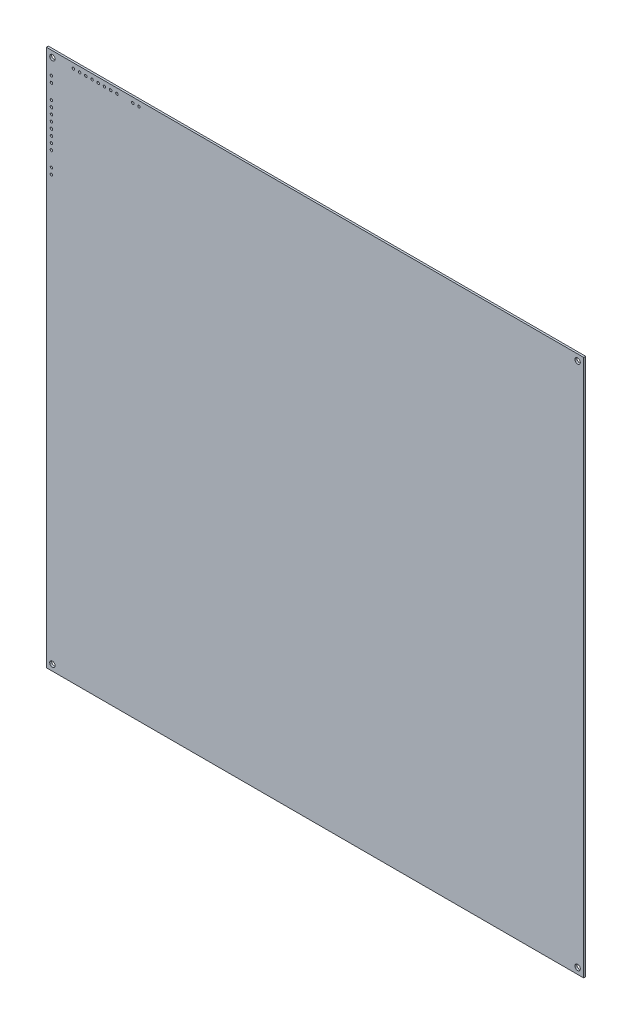
ISO-10303-21;
HEADER;
FILE_DESCRIPTION(('STEP AP214'),'2;1');
FILE_NAME('part.step','',(''),(''),'','','');
FILE_SCHEMA(('AUTOMOTIVE_DESIGN { 1 0 10303 214 1 1 1 1 }'));
ENDSEC;
DATA;
#1=APPLICATION_CONTEXT('core data for automotive mechanical design processes');
#2=APPLICATION_PROTOCOL_DEFINITION('international standard','automotive_design',2000,#1);
#3=PRODUCT_CONTEXT('',#1,'mechanical');
#4=PRODUCT('Part','Part','',(#3));
#5=PRODUCT_RELATED_PRODUCT_CATEGORY('part','',(#4));
#6=PRODUCT_DEFINITION_FORMATION('','',#4);
#7=PRODUCT_DEFINITION_CONTEXT('part definition',#1,'design');
#8=PRODUCT_DEFINITION('design','',#6,#7);
#9=PRODUCT_DEFINITION_SHAPE('','',#8);
#10=(LENGTH_UNIT() NAMED_UNIT(*) SI_UNIT(.MILLI.,.METRE.));
#11=(NAMED_UNIT(*) PLANE_ANGLE_UNIT() SI_UNIT($,.RADIAN.));
#12=(NAMED_UNIT(*) SI_UNIT($,.STERADIAN.) SOLID_ANGLE_UNIT());
#13=UNCERTAINTY_MEASURE_WITH_UNIT(LENGTH_MEASURE(1.E-05),#10,'distance_accuracy_value','');
#14=(GEOMETRIC_REPRESENTATION_CONTEXT(3) GLOBAL_UNCERTAINTY_ASSIGNED_CONTEXT((#13)) GLOBAL_UNIT_ASSIGNED_CONTEXT((#10,
#11,#12)) REPRESENTATION_CONTEXT('',''));
#15=CARTESIAN_POINT('',(0.,0.,0.));
#16=DIRECTION('',(0.,0.,1.));
#17=DIRECTION('',(1.,0.,0.));
#18=AXIS2_PLACEMENT_3D('',#15,#16,#17);
#19=CARTESIAN_POINT('',(0.,-220.,0.8));
#20=DIRECTION('',(0.,-1.,0.));
#21=DIRECTION('',(0.,0.,-1.));
#22=AXIS2_PLACEMENT_3D('',#19,#20,#21);
#23=PLANE('',#22);
#24=DIRECTION('',(1.,0.,0.));
#25=VECTOR('',#24,1.);
#26=CARTESIAN_POINT('',(0.,-220.,1.6));
#27=LINE('',#26,#25);
#28=CARTESIAN_POINT('',(0.,-220.,1.6));
#29=VERTEX_POINT('',#28);
#30=CARTESIAN_POINT('',(220.,-220.,1.6));
#31=VERTEX_POINT('',#30);
#32=EDGE_CURVE('E98',#29,#31,#27,.T.);
#33=ORIENTED_EDGE('',*,*,#32,.F.);
#34=DIRECTION('',(0.,0.,1.));
#35=VECTOR('',#34,1.);
#36=CARTESIAN_POINT('',(0.,-220.,0.8));
#37=LINE('',#36,#35);
#38=CARTESIAN_POINT('',(0.,-220.,0.8));
#39=VERTEX_POINT('',#38);
#40=EDGE_CURVE('E11',#39,#29,#37,.T.);
#41=ORIENTED_EDGE('',*,*,#40,.F.);
#42=DIRECTION('',(1.,0.,0.));
#43=VECTOR('',#42,1.);
#44=CARTESIAN_POINT('',(0.,-220.,0.8));
#45=LINE('',#44,#43);
#46=CARTESIAN_POINT('',(220.,-220.,0.8));
#47=VERTEX_POINT('',#46);
#48=EDGE_CURVE('E91',#39,#47,#45,.T.);
#49=ORIENTED_EDGE('',*,*,#48,.T.);
#50=DIRECTION('',(0.,0.,1.));
#51=VECTOR('',#50,1.);
#52=CARTESIAN_POINT('',(220.,-220.,0.8));
#53=LINE('',#52,#51);
#54=EDGE_CURVE('E36',#47,#31,#53,.T.);
#55=ORIENTED_EDGE('',*,*,#54,.T.);
#56=EDGE_LOOP('',(#33,#41,#49,#55));
#57=FACE_BOUND('',#56,.T.);
#58=ADVANCED_FACE('F33',(#57),#23,.T.);
#59=CARTESIAN_POINT('',(0.,0.,0.8));
#60=DIRECTION('',(-1.,0.,0.));
#61=DIRECTION('',(0.,0.,1.));
#62=AXIS2_PLACEMENT_3D('',#59,#60,#61);
#63=PLANE('',#62);
#64=DIRECTION('',(0.,-1.,0.));
#65=VECTOR('',#64,1.);
#66=CARTESIAN_POINT('',(0.,0.,1.6));
#67=LINE('',#66,#65);
#68=CARTESIAN_POINT('',(0.,0.,1.6));
#69=VERTEX_POINT('',#68);
#70=EDGE_CURVE('E93',#69,#29,#67,.T.);
#71=ORIENTED_EDGE('',*,*,#70,.F.);
#72=DIRECTION('',(0.,0.,1.));
#73=VECTOR('',#72,1.);
#74=CARTESIAN_POINT('',(0.,0.,0.8));
#75=LINE('',#74,#73);
#76=CARTESIAN_POINT('',(0.,0.,0.8));
#77=VERTEX_POINT('',#76);
#78=EDGE_CURVE('E42',#77,#69,#75,.T.);
#79=ORIENTED_EDGE('',*,*,#78,.F.);
#80=DIRECTION('',(0.,-1.,0.));
#81=VECTOR('',#80,1.);
#82=CARTESIAN_POINT('',(0.,0.,0.8));
#83=LINE('',#82,#81);
#84=EDGE_CURVE('E88',#77,#39,#83,.T.);
#85=ORIENTED_EDGE('',*,*,#84,.T.);
#86=ORIENTED_EDGE('',*,*,#40,.T.);
#87=EDGE_LOOP('',(#71,#79,#85,#86));
#88=FACE_BOUND('',#87,.T.);
#89=ADVANCED_FACE('F109',(#88),#63,.T.);
#90=CARTESIAN_POINT('',(220.,0.,0.8));
#91=DIRECTION('',(0.,1.,0.));
#92=DIRECTION('',(0.,0.,1.));
#93=AXIS2_PLACEMENT_3D('',#90,#91,#92);
#94=PLANE('',#93);
#95=DIRECTION('',(-1.,0.,0.));
#96=VECTOR('',#95,1.);
#97=CARTESIAN_POINT('',(220.,0.,1.6));
#98=LINE('',#97,#96);
#99=CARTESIAN_POINT('',(220.,0.,1.6));
#100=VERTEX_POINT('',#99);
#101=EDGE_CURVE('E83',#100,#69,#98,.T.);
#102=ORIENTED_EDGE('',*,*,#101,.F.);
#103=DIRECTION('',(0.,0.,1.));
#104=VECTOR('',#103,1.);
#105=CARTESIAN_POINT('',(220.,0.,0.8));
#106=LINE('',#105,#104);
#107=CARTESIAN_POINT('',(220.,0.,0.8));
#108=VERTEX_POINT('',#107);
#109=EDGE_CURVE('E78',#108,#100,#106,.T.);
#110=ORIENTED_EDGE('',*,*,#109,.F.);
#111=DIRECTION('',(-1.,0.,0.));
#112=VECTOR('',#111,1.);
#113=CARTESIAN_POINT('',(220.,0.,0.8));
#114=LINE('',#113,#112);
#115=EDGE_CURVE('E81',#108,#77,#114,.T.);
#116=ORIENTED_EDGE('',*,*,#115,.T.);
#117=ORIENTED_EDGE('',*,*,#78,.T.);
#118=EDGE_LOOP('',(#102,#110,#116,#117));
#119=FACE_BOUND('',#118,.T.);
#120=ADVANCED_FACE('F80',(#119),#94,.T.);
#121=CARTESIAN_POINT('',(220.,-220.,0.8));
#122=DIRECTION('',(1.,0.,0.));
#123=DIRECTION('',(0.,0.,-1.));
#124=AXIS2_PLACEMENT_3D('',#121,#122,#123);
#125=PLANE('',#124);
#126=DIRECTION('',(0.,1.,0.));
#127=VECTOR('',#126,1.);
#128=CARTESIAN_POINT('',(220.,-220.,1.6));
#129=LINE('',#128,#127);
#130=EDGE_CURVE('E101',#31,#100,#129,.T.);
#131=ORIENTED_EDGE('',*,*,#130,.F.);
#132=ORIENTED_EDGE('',*,*,#54,.F.);
#133=DIRECTION('',(0.,1.,0.));
#134=VECTOR('',#133,1.);
#135=CARTESIAN_POINT('',(220.,-220.,0.8));
#136=LINE('',#135,#134);
#137=EDGE_CURVE('E87',#47,#108,#136,.T.);
#138=ORIENTED_EDGE('',*,*,#137,.T.);
#139=ORIENTED_EDGE('',*,*,#109,.T.);
#140=EDGE_LOOP('',(#131,#132,#138,#139));
#141=FACE_BOUND('',#140,.T.);
#142=ADVANCED_FACE('F90',(#141),#125,.T.);
#143=CARTESIAN_POINT('',(0.,0.,0.8));
#144=DIRECTION('',(0.,0.,1.));
#145=DIRECTION('',(1.,0.,0.));
#146=AXIS2_PLACEMENT_3D('',#143,#144,#145);
#147=PLANE('',#146);
#148=CARTESIAN_POINT('',(13.64,-2.1,0.8));
#149=DIRECTION('',(0.,0.,1.));
#150=DIRECTION('',(-1.,0.,0.));
#151=AXIS2_PLACEMENT_3D('',#148,#149,#150);
#152=CIRCLE('',#151,0.5);
#153=CARTESIAN_POINT('',(13.14,-2.1,0.8));
#154=VERTEX_POINT('',#153);
#155=EDGE_CURVE('E238',#154,#154,#152,.T.);
#156=ORIENTED_EDGE('',*,*,#155,.T.);
#157=EDGE_LOOP('',(#156));
#158=FACE_BOUND('',#157,.T.);
#159=CARTESIAN_POINT('',(18.72,-2.1,0.8));
#160=DIRECTION('',(0.,0.,1.));
#161=DIRECTION('',(-1.,0.,0.));
#162=AXIS2_PLACEMENT_3D('',#159,#160,#161);
#163=CIRCLE('',#162,0.5);
#164=CARTESIAN_POINT('',(18.22,-2.1,0.8));
#165=VERTEX_POINT('',#164);
#166=EDGE_CURVE('E246',#165,#165,#163,.T.);
#167=ORIENTED_EDGE('',*,*,#166,.T.);
#168=EDGE_LOOP('',(#167));
#169=FACE_BOUND('',#168,.T.);
#170=CARTESIAN_POINT('',(16.18,-2.1,0.8));
#171=DIRECTION('',(0.,0.,1.));
#172=DIRECTION('',(-1.,0.,0.));
#173=AXIS2_PLACEMENT_3D('',#170,#171,#172);
#174=CIRCLE('',#173,0.5);
#175=CARTESIAN_POINT('',(15.68,-2.1,0.8));
#176=VERTEX_POINT('',#175);
#177=EDGE_CURVE('E252',#176,#176,#174,.T.);
#178=ORIENTED_EDGE('',*,*,#177,.T.);
#179=EDGE_LOOP('',(#178));
#180=FACE_BOUND('',#179,.T.);
#181=CARTESIAN_POINT('',(26.34,-2.1,0.8));
#182=DIRECTION('',(0.,0.,1.));
#183=DIRECTION('',(-1.,0.,0.));
#184=AXIS2_PLACEMENT_3D('',#181,#182,#183);
#185=CIRCLE('',#184,0.5);
#186=CARTESIAN_POINT('',(25.84,-2.1,0.8));
#187=VERTEX_POINT('',#186);
#188=EDGE_CURVE('E258',#187,#187,#185,.T.);
#189=ORIENTED_EDGE('',*,*,#188,.T.);
#190=EDGE_LOOP('',(#189));
#191=FACE_BOUND('',#190,.T.);
#192=CARTESIAN_POINT('',(23.8,-2.1,0.8));
#193=DIRECTION('',(0.,0.,1.));
#194=DIRECTION('',(-1.,0.,0.));
#195=AXIS2_PLACEMENT_3D('',#192,#193,#194);
#196=CIRCLE('',#195,0.5);
#197=CARTESIAN_POINT('',(23.3,-2.1,0.8));
#198=VERTEX_POINT('',#197);
#199=EDGE_CURVE('E264',#198,#198,#196,.T.);
#200=ORIENTED_EDGE('',*,*,#199,.T.);
#201=EDGE_LOOP('',(#200));
#202=FACE_BOUND('',#201,.T.);
#203=CARTESIAN_POINT('',(21.26,-2.1,0.8));
#204=DIRECTION('',(0.,0.,1.));
#205=DIRECTION('',(-1.,0.,0.));
#206=AXIS2_PLACEMENT_3D('',#203,#204,#205);
#207=CIRCLE('',#206,0.5);
#208=CARTESIAN_POINT('',(20.76,-2.1,0.8));
#209=VERTEX_POINT('',#208);
#210=EDGE_CURVE('E270',#209,#209,#207,.T.);
#211=ORIENTED_EDGE('',*,*,#210,.T.);
#212=EDGE_LOOP('',(#211));
#213=FACE_BOUND('',#212,.T.);
#214=CARTESIAN_POINT('',(28.88,-2.1,0.8));
#215=DIRECTION('',(0.,0.,1.));
#216=DIRECTION('',(-1.,0.,0.));
#217=AXIS2_PLACEMENT_3D('',#214,#215,#216);
#218=CIRCLE('',#217,0.5);
#219=CARTESIAN_POINT('',(28.38,-2.1,0.8));
#220=VERTEX_POINT('',#219);
#221=EDGE_CURVE('E276',#220,#220,#218,.T.);
#222=ORIENTED_EDGE('',*,*,#221,.T.);
#223=EDGE_LOOP('',(#222));
#224=FACE_BOUND('',#223,.T.);
#225=CARTESIAN_POINT('',(35.4,-2.1,0.8));
#226=DIRECTION('',(0.,0.,1.));
#227=DIRECTION('',(-1.,0.,0.));
#228=AXIS2_PLACEMENT_3D('',#225,#226,#227);
#229=CIRCLE('',#228,0.5);
#230=CARTESIAN_POINT('',(34.9,-2.1,0.8));
#231=VERTEX_POINT('',#230);
#232=EDGE_CURVE('E282',#231,#231,#229,.T.);
#233=ORIENTED_EDGE('',*,*,#232,.T.);
#234=EDGE_LOOP('',(#233));
#235=FACE_BOUND('',#234,.T.);
#236=CARTESIAN_POINT('',(37.94,-2.1,0.8));
#237=DIRECTION('',(0.,0.,1.));
#238=DIRECTION('',(-1.,0.,0.));
#239=AXIS2_PLACEMENT_3D('',#236,#237,#238);
#240=CIRCLE('',#239,0.5);
#241=CARTESIAN_POINT('',(37.44,-2.1,0.8));
#242=VERTEX_POINT('',#241);
#243=EDGE_CURVE('E288',#242,#242,#240,.T.);
#244=ORIENTED_EDGE('',*,*,#243,.T.);
#245=EDGE_LOOP('',(#244));
#246=FACE_BOUND('',#245,.T.);
#247=CARTESIAN_POINT('',(217.5,-2.5,0.8));
#248=DIRECTION('',(0.,0.,1.));
#249=DIRECTION('',(-1.,0.,0.));
#250=AXIS2_PLACEMENT_3D('',#247,#248,#249);
#251=CIRCLE('',#250,1.09999999999999);
#252=CARTESIAN_POINT('',(216.4,-2.5,0.8));
#253=VERTEX_POINT('',#252);
#254=EDGE_CURVE('E294',#253,#253,#251,.T.);
#255=ORIENTED_EDGE('',*,*,#254,.T.);
#256=EDGE_LOOP('',(#255));
#257=FACE_BOUND('',#256,.T.);
#258=CARTESIAN_POINT('',(2.5,-2.5,0.8));
#259=DIRECTION('',(0.,0.,1.));
#260=DIRECTION('',(-1.,0.,0.));
#261=AXIS2_PLACEMENT_3D('',#258,#259,#260);
#262=CIRCLE('',#261,1.1);
#263=CARTESIAN_POINT('',(1.4,-2.5,0.8));
#264=VERTEX_POINT('',#263);
#265=EDGE_CURVE('E300',#264,#264,#262,.T.);
#266=ORIENTED_EDGE('',*,*,#265,.T.);
#267=EDGE_LOOP('',(#266));
#268=FACE_BOUND('',#267,.T.);
#269=CARTESIAN_POINT('',(11.1,-2.1,0.8));
#270=DIRECTION('',(0.,0.,1.));
#271=DIRECTION('',(-1.,0.,0.));
#272=AXIS2_PLACEMENT_3D('',#269,#270,#271);
#273=CIRCLE('',#272,0.5);
#274=CARTESIAN_POINT('',(10.6,-2.1,0.8));
#275=VERTEX_POINT('',#274);
#276=EDGE_CURVE('E306',#275,#275,#273,.T.);
#277=ORIENTED_EDGE('',*,*,#276,.T.);
#278=EDGE_LOOP('',(#277));
#279=FACE_BOUND('',#278,.T.);
#280=CARTESIAN_POINT('',(2.1,-41.6,0.8));
#281=DIRECTION('',(0.,0.,1.));
#282=DIRECTION('',(-1.,0.,0.));
#283=AXIS2_PLACEMENT_3D('',#280,#281,#282);
#284=CIRCLE('',#283,0.5);
#285=CARTESIAN_POINT('',(1.6,-41.6,0.8));
#286=VERTEX_POINT('',#285);
#287=EDGE_CURVE('E312',#286,#286,#284,.T.);
#288=ORIENTED_EDGE('',*,*,#287,.T.);
#289=EDGE_LOOP('',(#288));
#290=FACE_BOUND('',#289,.T.);
#291=CARTESIAN_POINT('',(2.1,-35.5,0.8));
#292=DIRECTION('',(0.,0.,1.));
#293=DIRECTION('',(-1.,0.,0.));
#294=AXIS2_PLACEMENT_3D('',#291,#292,#293);
#295=CIRCLE('',#294,0.5);
#296=CARTESIAN_POINT('',(1.6,-35.5,0.8));
#297=VERTEX_POINT('',#296);
#298=EDGE_CURVE('E318',#297,#297,#295,.T.);
#299=ORIENTED_EDGE('',*,*,#298,.T.);
#300=EDGE_LOOP('',(#299));
#301=FACE_BOUND('',#300,.T.);
#302=CARTESIAN_POINT('',(2.1,-32.96,0.8));
#303=DIRECTION('',(0.,0.,1.));
#304=DIRECTION('',(-1.,0.,0.));
#305=AXIS2_PLACEMENT_3D('',#302,#303,#304);
#306=CIRCLE('',#305,0.5);
#307=CARTESIAN_POINT('',(1.6,-32.96,0.8));
#308=VERTEX_POINT('',#307);
#309=EDGE_CURVE('E324',#308,#308,#306,.T.);
#310=ORIENTED_EDGE('',*,*,#309,.T.);
#311=EDGE_LOOP('',(#310));
#312=FACE_BOUND('',#311,.T.);
#313=CARTESIAN_POINT('',(2.1,-22.8,0.8));
#314=DIRECTION('',(0.,0.,1.));
#315=DIRECTION('',(-1.,0.,0.));
#316=AXIS2_PLACEMENT_3D('',#313,#314,#315);
#317=CIRCLE('',#316,0.5);
#318=CARTESIAN_POINT('',(1.6,-22.8,0.8));
#319=VERTEX_POINT('',#318);
#320=EDGE_CURVE('E330',#319,#319,#317,.T.);
#321=ORIENTED_EDGE('',*,*,#320,.T.);
#322=EDGE_LOOP('',(#321));
#323=FACE_BOUND('',#322,.T.);
#324=CARTESIAN_POINT('',(2.1,-25.34,0.8));
#325=DIRECTION('',(0.,0.,1.));
#326=DIRECTION('',(-1.,0.,0.));
#327=AXIS2_PLACEMENT_3D('',#324,#325,#326);
#328=CIRCLE('',#327,0.5);
#329=CARTESIAN_POINT('',(1.6,-25.34,0.8));
#330=VERTEX_POINT('',#329);
#331=EDGE_CURVE('E336',#330,#330,#328,.T.);
#332=ORIENTED_EDGE('',*,*,#331,.T.);
#333=EDGE_LOOP('',(#332));
#334=FACE_BOUND('',#333,.T.);
#335=CARTESIAN_POINT('',(2.1,-30.42,0.8));
#336=DIRECTION('',(0.,0.,1.));
#337=DIRECTION('',(-1.,0.,0.));
#338=AXIS2_PLACEMENT_3D('',#335,#336,#337);
#339=CIRCLE('',#338,0.5);
#340=CARTESIAN_POINT('',(1.6,-30.42,0.8));
#341=VERTEX_POINT('',#340);
#342=EDGE_CURVE('E342',#341,#341,#339,.T.);
#343=ORIENTED_EDGE('',*,*,#342,.T.);
#344=EDGE_LOOP('',(#343));
#345=FACE_BOUND('',#344,.T.);
#346=CARTESIAN_POINT('',(2.1,-27.88,0.8));
#347=DIRECTION('',(0.,0.,1.));
#348=DIRECTION('',(-1.,0.,0.));
#349=AXIS2_PLACEMENT_3D('',#346,#347,#348);
#350=CIRCLE('',#349,0.5);
#351=CARTESIAN_POINT('',(1.6,-27.88,0.8));
#352=VERTEX_POINT('',#351);
#353=EDGE_CURVE('E348',#352,#352,#350,.T.);
#354=ORIENTED_EDGE('',*,*,#353,.T.);
#355=EDGE_LOOP('',(#354));
#356=FACE_BOUND('',#355,.T.);
#357=CARTESIAN_POINT('',(2.1,-20.26,0.8));
#358=DIRECTION('',(0.,0.,1.));
#359=DIRECTION('',(-1.,0.,0.));
#360=AXIS2_PLACEMENT_3D('',#357,#358,#359);
#361=CIRCLE('',#360,0.5);
#362=CARTESIAN_POINT('',(1.6,-20.26,0.8));
#363=VERTEX_POINT('',#362);
#364=EDGE_CURVE('E354',#363,#363,#361,.T.);
#365=ORIENTED_EDGE('',*,*,#364,.T.);
#366=EDGE_LOOP('',(#365));
#367=FACE_BOUND('',#366,.T.);
#368=CARTESIAN_POINT('',(2.1,-17.72,0.8));
#369=DIRECTION('',(0.,0.,1.));
#370=DIRECTION('',(-1.,0.,0.));
#371=AXIS2_PLACEMENT_3D('',#368,#369,#370);
#372=CIRCLE('',#371,0.5);
#373=CARTESIAN_POINT('',(1.6,-17.72,0.8));
#374=VERTEX_POINT('',#373);
#375=EDGE_CURVE('E360',#374,#374,#372,.T.);
#376=ORIENTED_EDGE('',*,*,#375,.T.);
#377=EDGE_LOOP('',(#376));
#378=FACE_BOUND('',#377,.T.);
#379=CARTESIAN_POINT('',(2.1,-9.06,0.8));
#380=DIRECTION('',(0.,0.,1.));
#381=DIRECTION('',(-1.,0.,0.));
#382=AXIS2_PLACEMENT_3D('',#379,#380,#381);
#383=CIRCLE('',#382,0.5);
#384=CARTESIAN_POINT('',(1.6,-9.06,0.8));
#385=VERTEX_POINT('',#384);
#386=EDGE_CURVE('E366',#385,#385,#383,.T.);
#387=ORIENTED_EDGE('',*,*,#386,.T.);
#388=EDGE_LOOP('',(#387));
#389=FACE_BOUND('',#388,.T.);
#390=CARTESIAN_POINT('',(2.1,-11.6,0.8));
#391=DIRECTION('',(0.,0.,1.));
#392=DIRECTION('',(-1.,0.,0.));
#393=AXIS2_PLACEMENT_3D('',#390,#391,#392);
#394=CIRCLE('',#393,0.5);
#395=CARTESIAN_POINT('',(1.6,-11.6,0.8));
#396=VERTEX_POINT('',#395);
#397=EDGE_CURVE('E372',#396,#396,#394,.T.);
#398=ORIENTED_EDGE('',*,*,#397,.T.);
#399=EDGE_LOOP('',(#398));
#400=FACE_BOUND('',#399,.T.);
#401=CARTESIAN_POINT('',(2.5,-217.5,0.8));
#402=DIRECTION('',(0.,0.,1.));
#403=DIRECTION('',(-1.,0.,0.));
#404=AXIS2_PLACEMENT_3D('',#401,#402,#403);
#405=CIRCLE('',#404,1.1);
#406=CARTESIAN_POINT('',(1.4,-217.5,0.8));
#407=VERTEX_POINT('',#406);
#408=EDGE_CURVE('E378',#407,#407,#405,.T.);
#409=ORIENTED_EDGE('',*,*,#408,.T.);
#410=EDGE_LOOP('',(#409));
#411=FACE_BOUND('',#410,.T.);
#412=CARTESIAN_POINT('',(2.1,-44.14,0.8));
#413=DIRECTION('',(0.,0.,1.));
#414=DIRECTION('',(-1.,0.,0.));
#415=AXIS2_PLACEMENT_3D('',#412,#413,#414);
#416=CIRCLE('',#415,0.5);
#417=CARTESIAN_POINT('',(1.6,-44.14,0.8));
#418=VERTEX_POINT('',#417);
#419=EDGE_CURVE('E384',#418,#418,#416,.T.);
#420=ORIENTED_EDGE('',*,*,#419,.T.);
#421=EDGE_LOOP('',(#420));
#422=FACE_BOUND('',#421,.T.);
#423=CARTESIAN_POINT('',(217.5,-217.5,0.8));
#424=DIRECTION('',(0.,0.,1.));
#425=DIRECTION('',(-1.,0.,0.));
#426=AXIS2_PLACEMENT_3D('',#423,#424,#425);
#427=CIRCLE('',#426,1.09999999999999);
#428=CARTESIAN_POINT('',(216.4,-217.5,0.8));
#429=VERTEX_POINT('',#428);
#430=EDGE_CURVE('E102',#429,#429,#427,.T.);
#431=ORIENTED_EDGE('',*,*,#430,.T.);
#432=EDGE_LOOP('',(#431));
#433=FACE_BOUND('',#432,.T.);
#434=ORIENTED_EDGE('',*,*,#48,.F.);
#435=ORIENTED_EDGE('',*,*,#84,.F.);
#436=ORIENTED_EDGE('',*,*,#115,.F.);
#437=ORIENTED_EDGE('',*,*,#137,.F.);
#438=EDGE_LOOP('',(#434,#435,#436,#437));
#439=FACE_BOUND('',#438,.T.);
#440=ADVANCED_FACE('F86',(#158,#169,#180,#191,#202,#213,#224,#235,#246,#257,#268,#279,#290,#301,
#312,#323,#334,#345,#356,#367,#378,#389,#400,#411,#422,#433,#439),#147,.F.);
#441=CARTESIAN_POINT('',(0.,0.,1.6));
#442=DIRECTION('',(0.,0.,1.));
#443=DIRECTION('',(1.,0.,0.));
#444=AXIS2_PLACEMENT_3D('',#441,#442,#443);
#445=PLANE('',#444);
#446=CARTESIAN_POINT('',(13.64,-2.1,1.6));
#447=DIRECTION('',(0.,0.,1.));
#448=DIRECTION('',(-1.,0.,0.));
#449=AXIS2_PLACEMENT_3D('',#446,#447,#448);
#450=CIRCLE('',#449,0.5);
#451=CARTESIAN_POINT('',(13.14,-2.1,1.6));
#452=VERTEX_POINT('',#451);
#453=EDGE_CURVE('E241',#452,#452,#450,.T.);
#454=ORIENTED_EDGE('',*,*,#453,.F.);
#455=EDGE_LOOP('',(#454));
#456=FACE_BOUND('',#455,.T.);
#457=CARTESIAN_POINT('',(18.72,-2.1,1.6));
#458=DIRECTION('',(0.,0.,1.));
#459=DIRECTION('',(-1.,0.,0.));
#460=AXIS2_PLACEMENT_3D('',#457,#458,#459);
#461=CIRCLE('',#460,0.5);
#462=CARTESIAN_POINT('',(18.22,-2.1,1.6));
#463=VERTEX_POINT('',#462);
#464=EDGE_CURVE('E243',#463,#463,#461,.T.);
#465=ORIENTED_EDGE('',*,*,#464,.F.);
#466=EDGE_LOOP('',(#465));
#467=FACE_BOUND('',#466,.T.);
#468=CARTESIAN_POINT('',(16.18,-2.1,1.6));
#469=DIRECTION('',(0.,0.,1.));
#470=DIRECTION('',(-1.,0.,0.));
#471=AXIS2_PLACEMENT_3D('',#468,#469,#470);
#472=CIRCLE('',#471,0.5);
#473=CARTESIAN_POINT('',(15.68,-2.1,1.6));
#474=VERTEX_POINT('',#473);
#475=EDGE_CURVE('E249',#474,#474,#472,.T.);
#476=ORIENTED_EDGE('',*,*,#475,.F.);
#477=EDGE_LOOP('',(#476));
#478=FACE_BOUND('',#477,.T.);
#479=CARTESIAN_POINT('',(26.34,-2.1,1.6));
#480=DIRECTION('',(0.,0.,1.));
#481=DIRECTION('',(-1.,0.,0.));
#482=AXIS2_PLACEMENT_3D('',#479,#480,#481);
#483=CIRCLE('',#482,0.5);
#484=CARTESIAN_POINT('',(25.84,-2.1,1.6));
#485=VERTEX_POINT('',#484);
#486=EDGE_CURVE('E255',#485,#485,#483,.T.);
#487=ORIENTED_EDGE('',*,*,#486,.F.);
#488=EDGE_LOOP('',(#487));
#489=FACE_BOUND('',#488,.T.);
#490=CARTESIAN_POINT('',(23.8,-2.1,1.6));
#491=DIRECTION('',(0.,0.,1.));
#492=DIRECTION('',(-1.,0.,0.));
#493=AXIS2_PLACEMENT_3D('',#490,#491,#492);
#494=CIRCLE('',#493,0.5);
#495=CARTESIAN_POINT('',(23.3,-2.1,1.6));
#496=VERTEX_POINT('',#495);
#497=EDGE_CURVE('E261',#496,#496,#494,.T.);
#498=ORIENTED_EDGE('',*,*,#497,.F.);
#499=EDGE_LOOP('',(#498));
#500=FACE_BOUND('',#499,.T.);
#501=CARTESIAN_POINT('',(21.26,-2.1,1.6));
#502=DIRECTION('',(0.,0.,1.));
#503=DIRECTION('',(-1.,0.,0.));
#504=AXIS2_PLACEMENT_3D('',#501,#502,#503);
#505=CIRCLE('',#504,0.5);
#506=CARTESIAN_POINT('',(20.76,-2.1,1.6));
#507=VERTEX_POINT('',#506);
#508=EDGE_CURVE('E267',#507,#507,#505,.T.);
#509=ORIENTED_EDGE('',*,*,#508,.F.);
#510=EDGE_LOOP('',(#509));
#511=FACE_BOUND('',#510,.T.);
#512=CARTESIAN_POINT('',(28.88,-2.1,1.6));
#513=DIRECTION('',(0.,0.,1.));
#514=DIRECTION('',(-1.,0.,0.));
#515=AXIS2_PLACEMENT_3D('',#512,#513,#514);
#516=CIRCLE('',#515,0.5);
#517=CARTESIAN_POINT('',(28.38,-2.1,1.6));
#518=VERTEX_POINT('',#517);
#519=EDGE_CURVE('E273',#518,#518,#516,.T.);
#520=ORIENTED_EDGE('',*,*,#519,.F.);
#521=EDGE_LOOP('',(#520));
#522=FACE_BOUND('',#521,.T.);
#523=CARTESIAN_POINT('',(35.4,-2.1,1.6));
#524=DIRECTION('',(0.,0.,1.));
#525=DIRECTION('',(-1.,0.,0.));
#526=AXIS2_PLACEMENT_3D('',#523,#524,#525);
#527=CIRCLE('',#526,0.5);
#528=CARTESIAN_POINT('',(34.9,-2.1,1.6));
#529=VERTEX_POINT('',#528);
#530=EDGE_CURVE('E279',#529,#529,#527,.T.);
#531=ORIENTED_EDGE('',*,*,#530,.F.);
#532=EDGE_LOOP('',(#531));
#533=FACE_BOUND('',#532,.T.);
#534=CARTESIAN_POINT('',(37.94,-2.1,1.6));
#535=DIRECTION('',(0.,0.,1.));
#536=DIRECTION('',(-1.,0.,0.));
#537=AXIS2_PLACEMENT_3D('',#534,#535,#536);
#538=CIRCLE('',#537,0.5);
#539=CARTESIAN_POINT('',(37.44,-2.1,1.6));
#540=VERTEX_POINT('',#539);
#541=EDGE_CURVE('E285',#540,#540,#538,.T.);
#542=ORIENTED_EDGE('',*,*,#541,.F.);
#543=EDGE_LOOP('',(#542));
#544=FACE_BOUND('',#543,.T.);
#545=CARTESIAN_POINT('',(217.5,-2.5,1.6));
#546=DIRECTION('',(0.,0.,1.));
#547=DIRECTION('',(-1.,0.,0.));
#548=AXIS2_PLACEMENT_3D('',#545,#546,#547);
#549=CIRCLE('',#548,1.09999999999999);
#550=CARTESIAN_POINT('',(216.4,-2.5,1.6));
#551=VERTEX_POINT('',#550);
#552=EDGE_CURVE('E291',#551,#551,#549,.T.);
#553=ORIENTED_EDGE('',*,*,#552,.F.);
#554=EDGE_LOOP('',(#553));
#555=FACE_BOUND('',#554,.T.);
#556=CARTESIAN_POINT('',(2.5,-2.5,1.6));
#557=DIRECTION('',(0.,0.,1.));
#558=DIRECTION('',(-1.,0.,0.));
#559=AXIS2_PLACEMENT_3D('',#556,#557,#558);
#560=CIRCLE('',#559,1.1);
#561=CARTESIAN_POINT('',(1.4,-2.5,1.6));
#562=VERTEX_POINT('',#561);
#563=EDGE_CURVE('E297',#562,#562,#560,.T.);
#564=ORIENTED_EDGE('',*,*,#563,.F.);
#565=EDGE_LOOP('',(#564));
#566=FACE_BOUND('',#565,.T.);
#567=CARTESIAN_POINT('',(11.1,-2.1,1.6));
#568=DIRECTION('',(0.,0.,1.));
#569=DIRECTION('',(-1.,0.,0.));
#570=AXIS2_PLACEMENT_3D('',#567,#568,#569);
#571=CIRCLE('',#570,0.5);
#572=CARTESIAN_POINT('',(10.6,-2.1,1.6));
#573=VERTEX_POINT('',#572);
#574=EDGE_CURVE('E303',#573,#573,#571,.T.);
#575=ORIENTED_EDGE('',*,*,#574,.F.);
#576=EDGE_LOOP('',(#575));
#577=FACE_BOUND('',#576,.T.);
#578=CARTESIAN_POINT('',(2.1,-41.6,1.6));
#579=DIRECTION('',(0.,0.,1.));
#580=DIRECTION('',(-1.,0.,0.));
#581=AXIS2_PLACEMENT_3D('',#578,#579,#580);
#582=CIRCLE('',#581,0.5);
#583=CARTESIAN_POINT('',(1.6,-41.6,1.6));
#584=VERTEX_POINT('',#583);
#585=EDGE_CURVE('E309',#584,#584,#582,.T.);
#586=ORIENTED_EDGE('',*,*,#585,.F.);
#587=EDGE_LOOP('',(#586));
#588=FACE_BOUND('',#587,.T.);
#589=CARTESIAN_POINT('',(2.1,-35.5,1.6));
#590=DIRECTION('',(0.,0.,1.));
#591=DIRECTION('',(-1.,0.,0.));
#592=AXIS2_PLACEMENT_3D('',#589,#590,#591);
#593=CIRCLE('',#592,0.5);
#594=CARTESIAN_POINT('',(1.6,-35.5,1.6));
#595=VERTEX_POINT('',#594);
#596=EDGE_CURVE('E315',#595,#595,#593,.T.);
#597=ORIENTED_EDGE('',*,*,#596,.F.);
#598=EDGE_LOOP('',(#597));
#599=FACE_BOUND('',#598,.T.);
#600=CARTESIAN_POINT('',(2.1,-32.96,1.6));
#601=DIRECTION('',(0.,0.,1.));
#602=DIRECTION('',(-1.,0.,0.));
#603=AXIS2_PLACEMENT_3D('',#600,#601,#602);
#604=CIRCLE('',#603,0.5);
#605=CARTESIAN_POINT('',(1.6,-32.96,1.6));
#606=VERTEX_POINT('',#605);
#607=EDGE_CURVE('E321',#606,#606,#604,.T.);
#608=ORIENTED_EDGE('',*,*,#607,.F.);
#609=EDGE_LOOP('',(#608));
#610=FACE_BOUND('',#609,.T.);
#611=CARTESIAN_POINT('',(2.1,-22.8,1.6));
#612=DIRECTION('',(0.,0.,1.));
#613=DIRECTION('',(-1.,0.,0.));
#614=AXIS2_PLACEMENT_3D('',#611,#612,#613);
#615=CIRCLE('',#614,0.5);
#616=CARTESIAN_POINT('',(1.6,-22.8,1.6));
#617=VERTEX_POINT('',#616);
#618=EDGE_CURVE('E327',#617,#617,#615,.T.);
#619=ORIENTED_EDGE('',*,*,#618,.F.);
#620=EDGE_LOOP('',(#619));
#621=FACE_BOUND('',#620,.T.);
#622=CARTESIAN_POINT('',(2.1,-25.34,1.6));
#623=DIRECTION('',(0.,0.,1.));
#624=DIRECTION('',(-1.,0.,0.));
#625=AXIS2_PLACEMENT_3D('',#622,#623,#624);
#626=CIRCLE('',#625,0.5);
#627=CARTESIAN_POINT('',(1.6,-25.34,1.6));
#628=VERTEX_POINT('',#627);
#629=EDGE_CURVE('E333',#628,#628,#626,.T.);
#630=ORIENTED_EDGE('',*,*,#629,.F.);
#631=EDGE_LOOP('',(#630));
#632=FACE_BOUND('',#631,.T.);
#633=CARTESIAN_POINT('',(2.1,-30.42,1.6));
#634=DIRECTION('',(0.,0.,1.));
#635=DIRECTION('',(-1.,0.,0.));
#636=AXIS2_PLACEMENT_3D('',#633,#634,#635);
#637=CIRCLE('',#636,0.5);
#638=CARTESIAN_POINT('',(1.6,-30.42,1.6));
#639=VERTEX_POINT('',#638);
#640=EDGE_CURVE('E339',#639,#639,#637,.T.);
#641=ORIENTED_EDGE('',*,*,#640,.F.);
#642=EDGE_LOOP('',(#641));
#643=FACE_BOUND('',#642,.T.);
#644=CARTESIAN_POINT('',(2.1,-27.88,1.6));
#645=DIRECTION('',(0.,0.,1.));
#646=DIRECTION('',(-1.,0.,0.));
#647=AXIS2_PLACEMENT_3D('',#644,#645,#646);
#648=CIRCLE('',#647,0.5);
#649=CARTESIAN_POINT('',(1.6,-27.88,1.6));
#650=VERTEX_POINT('',#649);
#651=EDGE_CURVE('E345',#650,#650,#648,.T.);
#652=ORIENTED_EDGE('',*,*,#651,.F.);
#653=EDGE_LOOP('',(#652));
#654=FACE_BOUND('',#653,.T.);
#655=CARTESIAN_POINT('',(2.1,-20.26,1.6));
#656=DIRECTION('',(0.,0.,1.));
#657=DIRECTION('',(-1.,0.,0.));
#658=AXIS2_PLACEMENT_3D('',#655,#656,#657);
#659=CIRCLE('',#658,0.5);
#660=CARTESIAN_POINT('',(1.6,-20.26,1.6));
#661=VERTEX_POINT('',#660);
#662=EDGE_CURVE('E351',#661,#661,#659,.T.);
#663=ORIENTED_EDGE('',*,*,#662,.F.);
#664=EDGE_LOOP('',(#663));
#665=FACE_BOUND('',#664,.T.);
#666=CARTESIAN_POINT('',(2.1,-17.72,1.6));
#667=DIRECTION('',(0.,0.,1.));
#668=DIRECTION('',(-1.,0.,0.));
#669=AXIS2_PLACEMENT_3D('',#666,#667,#668);
#670=CIRCLE('',#669,0.5);
#671=CARTESIAN_POINT('',(1.6,-17.72,1.6));
#672=VERTEX_POINT('',#671);
#673=EDGE_CURVE('E357',#672,#672,#670,.T.);
#674=ORIENTED_EDGE('',*,*,#673,.F.);
#675=EDGE_LOOP('',(#674));
#676=FACE_BOUND('',#675,.T.);
#677=CARTESIAN_POINT('',(2.1,-9.06,1.6));
#678=DIRECTION('',(0.,0.,1.));
#679=DIRECTION('',(-1.,0.,0.));
#680=AXIS2_PLACEMENT_3D('',#677,#678,#679);
#681=CIRCLE('',#680,0.5);
#682=CARTESIAN_POINT('',(1.6,-9.06,1.6));
#683=VERTEX_POINT('',#682);
#684=EDGE_CURVE('E363',#683,#683,#681,.T.);
#685=ORIENTED_EDGE('',*,*,#684,.F.);
#686=EDGE_LOOP('',(#685));
#687=FACE_BOUND('',#686,.T.);
#688=CARTESIAN_POINT('',(2.1,-11.6,1.6));
#689=DIRECTION('',(0.,0.,1.));
#690=DIRECTION('',(-1.,0.,0.));
#691=AXIS2_PLACEMENT_3D('',#688,#689,#690);
#692=CIRCLE('',#691,0.5);
#693=CARTESIAN_POINT('',(1.6,-11.6,1.6));
#694=VERTEX_POINT('',#693);
#695=EDGE_CURVE('E369',#694,#694,#692,.T.);
#696=ORIENTED_EDGE('',*,*,#695,.F.);
#697=EDGE_LOOP('',(#696));
#698=FACE_BOUND('',#697,.T.);
#699=CARTESIAN_POINT('',(2.5,-217.5,1.6));
#700=DIRECTION('',(0.,0.,1.));
#701=DIRECTION('',(-1.,0.,0.));
#702=AXIS2_PLACEMENT_3D('',#699,#700,#701);
#703=CIRCLE('',#702,1.1);
#704=CARTESIAN_POINT('',(1.4,-217.5,1.6));
#705=VERTEX_POINT('',#704);
#706=EDGE_CURVE('E375',#705,#705,#703,.T.);
#707=ORIENTED_EDGE('',*,*,#706,.F.);
#708=EDGE_LOOP('',(#707));
#709=FACE_BOUND('',#708,.T.);
#710=CARTESIAN_POINT('',(2.1,-44.14,1.6));
#711=DIRECTION('',(0.,0.,1.));
#712=DIRECTION('',(-1.,0.,0.));
#713=AXIS2_PLACEMENT_3D('',#710,#711,#712);
#714=CIRCLE('',#713,0.5);
#715=CARTESIAN_POINT('',(1.6,-44.14,1.6));
#716=VERTEX_POINT('',#715);
#717=EDGE_CURVE('E381',#716,#716,#714,.T.);
#718=ORIENTED_EDGE('',*,*,#717,.F.);
#719=EDGE_LOOP('',(#718));
#720=FACE_BOUND('',#719,.T.);
#721=CARTESIAN_POINT('',(217.5,-217.5,1.6));
#722=DIRECTION('',(0.,0.,1.));
#723=DIRECTION('',(-1.,0.,0.));
#724=AXIS2_PLACEMENT_3D('',#721,#722,#723);
#725=CIRCLE('',#724,1.09999999999999);
#726=CARTESIAN_POINT('',(216.4,-217.5,1.6));
#727=VERTEX_POINT('',#726);
#728=EDGE_CURVE('E387',#727,#727,#725,.T.);
#729=ORIENTED_EDGE('',*,*,#728,.F.);
#730=EDGE_LOOP('',(#729));
#731=FACE_BOUND('',#730,.T.);
#732=ORIENTED_EDGE('',*,*,#32,.T.);
#733=ORIENTED_EDGE('',*,*,#130,.T.);
#734=ORIENTED_EDGE('',*,*,#101,.T.);
#735=ORIENTED_EDGE('',*,*,#70,.T.);
#736=EDGE_LOOP('',(#732,#733,#734,#735));
#737=FACE_BOUND('',#736,.T.);
#738=ADVANCED_FACE('F108',(#456,#467,#478,#489,#500,#511,#522,#533,#544,#555,#566,#577,#588,
#599,#610,#621,#632,#643,#654,#665,#676,#687,#698,#709,#720,#731,#737),#445,.T.);
#739=CARTESIAN_POINT('',(217.5,-217.5,0.8));
#740=DIRECTION('',(0.,0.,1.));
#741=DIRECTION('',(1.,0.,0.));
#742=AXIS2_PLACEMENT_3D('',#739,#740,#741);
#743=CYLINDRICAL_SURFACE('',#742,1.09999999999999);
#744=ORIENTED_EDGE('',*,*,#430,.F.);
#745=EDGE_LOOP('',(#744));
#746=FACE_BOUND('',#745,.T.);
#747=ORIENTED_EDGE('',*,*,#728,.T.);
#748=EDGE_LOOP('',(#747));
#749=FACE_BOUND('',#748,.T.);
#750=ADVANCED_FACE('F127',(#746,#749),#743,.F.);
#751=CARTESIAN_POINT('',(2.1,-44.14,0.8));
#752=DIRECTION('',(0.,0.,1.));
#753=DIRECTION('',(1.,0.,0.));
#754=AXIS2_PLACEMENT_3D('',#751,#752,#753);
#755=CYLINDRICAL_SURFACE('',#754,0.5);
#756=ORIENTED_EDGE('',*,*,#419,.F.);
#757=EDGE_LOOP('',(#756));
#758=FACE_BOUND('',#757,.T.);
#759=ORIENTED_EDGE('',*,*,#717,.T.);
#760=EDGE_LOOP('',(#759));
#761=FACE_BOUND('',#760,.T.);
#762=ADVANCED_FACE('F134',(#758,#761),#755,.F.);
#763=CARTESIAN_POINT('',(2.5,-217.5,0.8));
#764=DIRECTION('',(0.,0.,1.));
#765=DIRECTION('',(1.,0.,0.));
#766=AXIS2_PLACEMENT_3D('',#763,#764,#765);
#767=CYLINDRICAL_SURFACE('',#766,1.1);
#768=ORIENTED_EDGE('',*,*,#408,.F.);
#769=EDGE_LOOP('',(#768));
#770=FACE_BOUND('',#769,.T.);
#771=ORIENTED_EDGE('',*,*,#706,.T.);
#772=EDGE_LOOP('',(#771));
#773=FACE_BOUND('',#772,.T.);
#774=ADVANCED_FACE('F138',(#770,#773),#767,.F.);
#775=CARTESIAN_POINT('',(2.1,-11.6,0.8));
#776=DIRECTION('',(0.,0.,1.));
#777=DIRECTION('',(1.,0.,0.));
#778=AXIS2_PLACEMENT_3D('',#775,#776,#777);
#779=CYLINDRICAL_SURFACE('',#778,0.5);
#780=ORIENTED_EDGE('',*,*,#397,.F.);
#781=EDGE_LOOP('',(#780));
#782=FACE_BOUND('',#781,.T.);
#783=ORIENTED_EDGE('',*,*,#695,.T.);
#784=EDGE_LOOP('',(#783));
#785=FACE_BOUND('',#784,.T.);
#786=ADVANCED_FACE('F142',(#782,#785),#779,.F.);
#787=CARTESIAN_POINT('',(2.1,-9.06,0.8));
#788=DIRECTION('',(0.,0.,1.));
#789=DIRECTION('',(1.,0.,0.));
#790=AXIS2_PLACEMENT_3D('',#787,#788,#789);
#791=CYLINDRICAL_SURFACE('',#790,0.5);
#792=ORIENTED_EDGE('',*,*,#386,.F.);
#793=EDGE_LOOP('',(#792));
#794=FACE_BOUND('',#793,.T.);
#795=ORIENTED_EDGE('',*,*,#684,.T.);
#796=EDGE_LOOP('',(#795));
#797=FACE_BOUND('',#796,.T.);
#798=ADVANCED_FACE('F146',(#794,#797),#791,.F.);
#799=CARTESIAN_POINT('',(2.1,-17.72,0.8));
#800=DIRECTION('',(0.,0.,1.));
#801=DIRECTION('',(1.,0.,0.));
#802=AXIS2_PLACEMENT_3D('',#799,#800,#801);
#803=CYLINDRICAL_SURFACE('',#802,0.5);
#804=ORIENTED_EDGE('',*,*,#375,.F.);
#805=EDGE_LOOP('',(#804));
#806=FACE_BOUND('',#805,.T.);
#807=ORIENTED_EDGE('',*,*,#673,.T.);
#808=EDGE_LOOP('',(#807));
#809=FACE_BOUND('',#808,.T.);
#810=ADVANCED_FACE('F150',(#806,#809),#803,.F.);
#811=CARTESIAN_POINT('',(2.1,-20.26,0.8));
#812=DIRECTION('',(0.,0.,1.));
#813=DIRECTION('',(1.,0.,0.));
#814=AXIS2_PLACEMENT_3D('',#811,#812,#813);
#815=CYLINDRICAL_SURFACE('',#814,0.5);
#816=ORIENTED_EDGE('',*,*,#364,.F.);
#817=EDGE_LOOP('',(#816));
#818=FACE_BOUND('',#817,.T.);
#819=ORIENTED_EDGE('',*,*,#662,.T.);
#820=EDGE_LOOP('',(#819));
#821=FACE_BOUND('',#820,.T.);
#822=ADVANCED_FACE('F154',(#818,#821),#815,.F.);
#823=CARTESIAN_POINT('',(2.1,-27.88,0.8));
#824=DIRECTION('',(0.,0.,1.));
#825=DIRECTION('',(1.,0.,0.));
#826=AXIS2_PLACEMENT_3D('',#823,#824,#825);
#827=CYLINDRICAL_SURFACE('',#826,0.5);
#828=ORIENTED_EDGE('',*,*,#353,.F.);
#829=EDGE_LOOP('',(#828));
#830=FACE_BOUND('',#829,.T.);
#831=ORIENTED_EDGE('',*,*,#651,.T.);
#832=EDGE_LOOP('',(#831));
#833=FACE_BOUND('',#832,.T.);
#834=ADVANCED_FACE('F158',(#830,#833),#827,.F.);
#835=CARTESIAN_POINT('',(2.1,-30.42,0.8));
#836=DIRECTION('',(0.,0.,1.));
#837=DIRECTION('',(1.,0.,0.));
#838=AXIS2_PLACEMENT_3D('',#835,#836,#837);
#839=CYLINDRICAL_SURFACE('',#838,0.5);
#840=ORIENTED_EDGE('',*,*,#342,.F.);
#841=EDGE_LOOP('',(#840));
#842=FACE_BOUND('',#841,.T.);
#843=ORIENTED_EDGE('',*,*,#640,.T.);
#844=EDGE_LOOP('',(#843));
#845=FACE_BOUND('',#844,.T.);
#846=ADVANCED_FACE('F162',(#842,#845),#839,.F.);
#847=CARTESIAN_POINT('',(2.1,-25.34,0.8));
#848=DIRECTION('',(0.,0.,1.));
#849=DIRECTION('',(1.,0.,0.));
#850=AXIS2_PLACEMENT_3D('',#847,#848,#849);
#851=CYLINDRICAL_SURFACE('',#850,0.5);
#852=ORIENTED_EDGE('',*,*,#331,.F.);
#853=EDGE_LOOP('',(#852));
#854=FACE_BOUND('',#853,.T.);
#855=ORIENTED_EDGE('',*,*,#629,.T.);
#856=EDGE_LOOP('',(#855));
#857=FACE_BOUND('',#856,.T.);
#858=ADVANCED_FACE('F166',(#854,#857),#851,.F.);
#859=CARTESIAN_POINT('',(2.1,-22.8,0.8));
#860=DIRECTION('',(0.,0.,1.));
#861=DIRECTION('',(1.,0.,0.));
#862=AXIS2_PLACEMENT_3D('',#859,#860,#861);
#863=CYLINDRICAL_SURFACE('',#862,0.5);
#864=ORIENTED_EDGE('',*,*,#320,.F.);
#865=EDGE_LOOP('',(#864));
#866=FACE_BOUND('',#865,.T.);
#867=ORIENTED_EDGE('',*,*,#618,.T.);
#868=EDGE_LOOP('',(#867));
#869=FACE_BOUND('',#868,.T.);
#870=ADVANCED_FACE('F170',(#866,#869),#863,.F.);
#871=CARTESIAN_POINT('',(2.1,-32.96,0.8));
#872=DIRECTION('',(0.,0.,1.));
#873=DIRECTION('',(1.,0.,0.));
#874=AXIS2_PLACEMENT_3D('',#871,#872,#873);
#875=CYLINDRICAL_SURFACE('',#874,0.5);
#876=ORIENTED_EDGE('',*,*,#309,.F.);
#877=EDGE_LOOP('',(#876));
#878=FACE_BOUND('',#877,.T.);
#879=ORIENTED_EDGE('',*,*,#607,.T.);
#880=EDGE_LOOP('',(#879));
#881=FACE_BOUND('',#880,.T.);
#882=ADVANCED_FACE('F174',(#878,#881),#875,.F.);
#883=CARTESIAN_POINT('',(2.1,-35.5,0.8));
#884=DIRECTION('',(0.,0.,1.));
#885=DIRECTION('',(1.,0.,0.));
#886=AXIS2_PLACEMENT_3D('',#883,#884,#885);
#887=CYLINDRICAL_SURFACE('',#886,0.5);
#888=ORIENTED_EDGE('',*,*,#298,.F.);
#889=EDGE_LOOP('',(#888));
#890=FACE_BOUND('',#889,.T.);
#891=ORIENTED_EDGE('',*,*,#596,.T.);
#892=EDGE_LOOP('',(#891));
#893=FACE_BOUND('',#892,.T.);
#894=ADVANCED_FACE('F178',(#890,#893),#887,.F.);
#895=CARTESIAN_POINT('',(2.1,-41.6,0.8));
#896=DIRECTION('',(0.,0.,1.));
#897=DIRECTION('',(1.,0.,0.));
#898=AXIS2_PLACEMENT_3D('',#895,#896,#897);
#899=CYLINDRICAL_SURFACE('',#898,0.5);
#900=ORIENTED_EDGE('',*,*,#287,.F.);
#901=EDGE_LOOP('',(#900));
#902=FACE_BOUND('',#901,.T.);
#903=ORIENTED_EDGE('',*,*,#585,.T.);
#904=EDGE_LOOP('',(#903));
#905=FACE_BOUND('',#904,.T.);
#906=ADVANCED_FACE('F182',(#902,#905),#899,.F.);
#907=CARTESIAN_POINT('',(11.1,-2.1,0.8));
#908=DIRECTION('',(0.,0.,1.));
#909=DIRECTION('',(1.,0.,0.));
#910=AXIS2_PLACEMENT_3D('',#907,#908,#909);
#911=CYLINDRICAL_SURFACE('',#910,0.5);
#912=ORIENTED_EDGE('',*,*,#276,.F.);
#913=EDGE_LOOP('',(#912));
#914=FACE_BOUND('',#913,.T.);
#915=ORIENTED_EDGE('',*,*,#574,.T.);
#916=EDGE_LOOP('',(#915));
#917=FACE_BOUND('',#916,.T.);
#918=ADVANCED_FACE('F186',(#914,#917),#911,.F.);
#919=CARTESIAN_POINT('',(2.5,-2.5,0.8));
#920=DIRECTION('',(0.,0.,1.));
#921=DIRECTION('',(1.,0.,0.));
#922=AXIS2_PLACEMENT_3D('',#919,#920,#921);
#923=CYLINDRICAL_SURFACE('',#922,1.1);
#924=ORIENTED_EDGE('',*,*,#265,.F.);
#925=EDGE_LOOP('',(#924));
#926=FACE_BOUND('',#925,.T.);
#927=ORIENTED_EDGE('',*,*,#563,.T.);
#928=EDGE_LOOP('',(#927));
#929=FACE_BOUND('',#928,.T.);
#930=ADVANCED_FACE('F190',(#926,#929),#923,.F.);
#931=CARTESIAN_POINT('',(217.5,-2.5,0.8));
#932=DIRECTION('',(0.,0.,1.));
#933=DIRECTION('',(1.,0.,0.));
#934=AXIS2_PLACEMENT_3D('',#931,#932,#933);
#935=CYLINDRICAL_SURFACE('',#934,1.09999999999999);
#936=ORIENTED_EDGE('',*,*,#254,.F.);
#937=EDGE_LOOP('',(#936));
#938=FACE_BOUND('',#937,.T.);
#939=ORIENTED_EDGE('',*,*,#552,.T.);
#940=EDGE_LOOP('',(#939));
#941=FACE_BOUND('',#940,.T.);
#942=ADVANCED_FACE('F194',(#938,#941),#935,.F.);
#943=CARTESIAN_POINT('',(37.94,-2.1,0.8));
#944=DIRECTION('',(0.,0.,1.));
#945=DIRECTION('',(1.,0.,0.));
#946=AXIS2_PLACEMENT_3D('',#943,#944,#945);
#947=CYLINDRICAL_SURFACE('',#946,0.5);
#948=ORIENTED_EDGE('',*,*,#243,.F.);
#949=EDGE_LOOP('',(#948));
#950=FACE_BOUND('',#949,.T.);
#951=ORIENTED_EDGE('',*,*,#541,.T.);
#952=EDGE_LOOP('',(#951));
#953=FACE_BOUND('',#952,.T.);
#954=ADVANCED_FACE('F198',(#950,#953),#947,.F.);
#955=CARTESIAN_POINT('',(35.4,-2.1,0.8));
#956=DIRECTION('',(0.,0.,1.));
#957=DIRECTION('',(1.,0.,0.));
#958=AXIS2_PLACEMENT_3D('',#955,#956,#957);
#959=CYLINDRICAL_SURFACE('',#958,0.5);
#960=ORIENTED_EDGE('',*,*,#232,.F.);
#961=EDGE_LOOP('',(#960));
#962=FACE_BOUND('',#961,.T.);
#963=ORIENTED_EDGE('',*,*,#530,.T.);
#964=EDGE_LOOP('',(#963));
#965=FACE_BOUND('',#964,.T.);
#966=ADVANCED_FACE('F202',(#962,#965),#959,.F.);
#967=CARTESIAN_POINT('',(28.88,-2.1,0.8));
#968=DIRECTION('',(0.,0.,1.));
#969=DIRECTION('',(1.,0.,0.));
#970=AXIS2_PLACEMENT_3D('',#967,#968,#969);
#971=CYLINDRICAL_SURFACE('',#970,0.5);
#972=ORIENTED_EDGE('',*,*,#221,.F.);
#973=EDGE_LOOP('',(#972));
#974=FACE_BOUND('',#973,.T.);
#975=ORIENTED_EDGE('',*,*,#519,.T.);
#976=EDGE_LOOP('',(#975));
#977=FACE_BOUND('',#976,.T.);
#978=ADVANCED_FACE('F206',(#974,#977),#971,.F.);
#979=CARTESIAN_POINT('',(21.26,-2.1,0.8));
#980=DIRECTION('',(0.,0.,1.));
#981=DIRECTION('',(1.,0.,0.));
#982=AXIS2_PLACEMENT_3D('',#979,#980,#981);
#983=CYLINDRICAL_SURFACE('',#982,0.5);
#984=ORIENTED_EDGE('',*,*,#210,.F.);
#985=EDGE_LOOP('',(#984));
#986=FACE_BOUND('',#985,.T.);
#987=ORIENTED_EDGE('',*,*,#508,.T.);
#988=EDGE_LOOP('',(#987));
#989=FACE_BOUND('',#988,.T.);
#990=ADVANCED_FACE('F210',(#986,#989),#983,.F.);
#991=CARTESIAN_POINT('',(23.8,-2.1,0.8));
#992=DIRECTION('',(0.,0.,1.));
#993=DIRECTION('',(1.,0.,0.));
#994=AXIS2_PLACEMENT_3D('',#991,#992,#993);
#995=CYLINDRICAL_SURFACE('',#994,0.5);
#996=ORIENTED_EDGE('',*,*,#199,.F.);
#997=EDGE_LOOP('',(#996));
#998=FACE_BOUND('',#997,.T.);
#999=ORIENTED_EDGE('',*,*,#497,.T.);
#1000=EDGE_LOOP('',(#999));
#1001=FACE_BOUND('',#1000,.T.);
#1002=ADVANCED_FACE('F214',(#998,#1001),#995,.F.);
#1003=CARTESIAN_POINT('',(26.34,-2.1,0.8));
#1004=DIRECTION('',(0.,0.,1.));
#1005=DIRECTION('',(1.,0.,0.));
#1006=AXIS2_PLACEMENT_3D('',#1003,#1004,#1005);
#1007=CYLINDRICAL_SURFACE('',#1006,0.5);
#1008=ORIENTED_EDGE('',*,*,#188,.F.);
#1009=EDGE_LOOP('',(#1008));
#1010=FACE_BOUND('',#1009,.T.);
#1011=ORIENTED_EDGE('',*,*,#486,.T.);
#1012=EDGE_LOOP('',(#1011));
#1013=FACE_BOUND('',#1012,.T.);
#1014=ADVANCED_FACE('F218',(#1010,#1013),#1007,.F.);
#1015=CARTESIAN_POINT('',(16.18,-2.1,0.8));
#1016=DIRECTION('',(0.,0.,1.));
#1017=DIRECTION('',(1.,0.,0.));
#1018=AXIS2_PLACEMENT_3D('',#1015,#1016,#1017);
#1019=CYLINDRICAL_SURFACE('',#1018,0.5);
#1020=ORIENTED_EDGE('',*,*,#177,.F.);
#1021=EDGE_LOOP('',(#1020));
#1022=FACE_BOUND('',#1021,.T.);
#1023=ORIENTED_EDGE('',*,*,#475,.T.);
#1024=EDGE_LOOP('',(#1023));
#1025=FACE_BOUND('',#1024,.T.);
#1026=ADVANCED_FACE('F222',(#1022,#1025),#1019,.F.);
#1027=CARTESIAN_POINT('',(18.72,-2.1,0.8));
#1028=DIRECTION('',(0.,0.,1.));
#1029=DIRECTION('',(1.,0.,0.));
#1030=AXIS2_PLACEMENT_3D('',#1027,#1028,#1029);
#1031=CYLINDRICAL_SURFACE('',#1030,0.5);
#1032=ORIENTED_EDGE('',*,*,#166,.F.);
#1033=EDGE_LOOP('',(#1032));
#1034=FACE_BOUND('',#1033,.T.);
#1035=ORIENTED_EDGE('',*,*,#464,.T.);
#1036=EDGE_LOOP('',(#1035));
#1037=FACE_BOUND('',#1036,.T.);
#1038=ADVANCED_FACE('F226',(#1034,#1037),#1031,.F.);
#1039=CARTESIAN_POINT('',(13.64,-2.1,0.8));
#1040=DIRECTION('',(0.,0.,1.));
#1041=DIRECTION('',(1.,0.,0.));
#1042=AXIS2_PLACEMENT_3D('',#1039,#1040,#1041);
#1043=CYLINDRICAL_SURFACE('',#1042,0.5);
#1044=ORIENTED_EDGE('',*,*,#155,.F.);
#1045=EDGE_LOOP('',(#1044));
#1046=FACE_BOUND('',#1045,.T.);
#1047=ORIENTED_EDGE('',*,*,#453,.T.);
#1048=EDGE_LOOP('',(#1047));
#1049=FACE_BOUND('',#1048,.T.);
#1050=ADVANCED_FACE('F230',(#1046,#1049),#1043,.F.);
#1051=CLOSED_SHELL('',(#58,#89,#120,#142,#440,#738,#750,#762,#774,#786,#798,#810,#822,#834,#846,
#858,#870,#882,#894,#906,#918,#930,#942,#954,#966,#978,#990,#1002,#1014,#1026,#1038,#1050));
#1052=MANIFOLD_SOLID_BREP('B2',#1051);
#1053=ADVANCED_BREP_SHAPE_REPRESENTATION('',(#18,#1052),#14);
#1054=SHAPE_DEFINITION_REPRESENTATION(#9,#1053);
ENDSEC;
END-ISO-10303-21;
